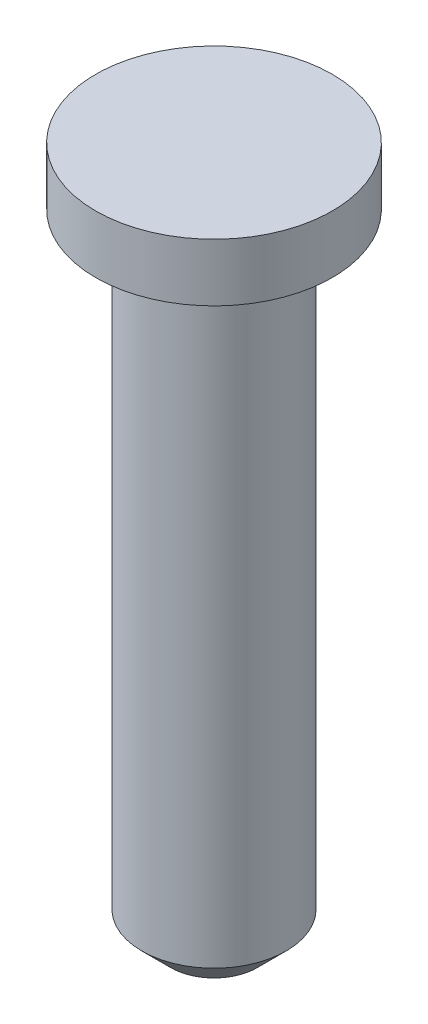
ISO-10303-21;
HEADER;
FILE_DESCRIPTION(('STEP AP214'),'2;1');
FILE_NAME('part.step','',(''),(''),'','','');
FILE_SCHEMA(('AUTOMOTIVE_DESIGN { 1 0 10303 214 1 1 1 1 }'));
ENDSEC;
DATA;
#1=APPLICATION_CONTEXT('core data for automotive mechanical design processes');
#2=APPLICATION_PROTOCOL_DEFINITION('international standard','automotive_design',2000,#1);
#3=PRODUCT_CONTEXT('',#1,'mechanical');
#4=PRODUCT('Part','Part','',(#3));
#5=PRODUCT_RELATED_PRODUCT_CATEGORY('part','',(#4));
#6=PRODUCT_DEFINITION_FORMATION('','',#4);
#7=PRODUCT_DEFINITION_CONTEXT('part definition',#1,'design');
#8=PRODUCT_DEFINITION('design','',#6,#7);
#9=PRODUCT_DEFINITION_SHAPE('','',#8);
#10=(LENGTH_UNIT() NAMED_UNIT(*) SI_UNIT(.MILLI.,.METRE.));
#11=(NAMED_UNIT(*) PLANE_ANGLE_UNIT() SI_UNIT($,.RADIAN.));
#12=(NAMED_UNIT(*) SI_UNIT($,.STERADIAN.) SOLID_ANGLE_UNIT());
#13=UNCERTAINTY_MEASURE_WITH_UNIT(LENGTH_MEASURE(1.E-05),#10,'distance_accuracy_value','');
#14=(GEOMETRIC_REPRESENTATION_CONTEXT(3) GLOBAL_UNCERTAINTY_ASSIGNED_CONTEXT((#13)) GLOBAL_UNIT_ASSIGNED_CONTEXT((#10,
#11,#12)) REPRESENTATION_CONTEXT('',''));
#15=CARTESIAN_POINT('',(0.,0.,0.));
#16=DIRECTION('',(0.,0.,1.));
#17=DIRECTION('',(1.,0.,0.));
#18=AXIS2_PLACEMENT_3D('',#15,#16,#17);
#19=CARTESIAN_POINT('',(0.,0.,0.));
#20=DIRECTION('',(0.,-1.,0.));
#21=DIRECTION('',(0.,0.,-1.));
#22=AXIS2_PLACEMENT_3D('',#19,#20,#21);
#23=PLANE('',#22);
#24=CARTESIAN_POINT('',(0.,0.,0.));
#25=DIRECTION('',(0.,1.,0.));
#26=DIRECTION('',(0.,0.,1.));
#27=AXIS2_PLACEMENT_3D('',#24,#25,#26);
#28=CIRCLE('',#27,2.05);
#29=CARTESIAN_POINT('',(0.,0.,2.05));
#30=VERTEX_POINT('',#29);
#31=EDGE_CURVE('E42',#30,#30,#28,.T.);
#32=ORIENTED_EDGE('',*,*,#31,.T.);
#33=EDGE_LOOP('',(#32));
#34=FACE_BOUND('',#33,.T.);
#35=ADVANCED_FACE('F31',(#34),#23,.F.);
#36=CARTESIAN_POINT('',(0.,0.,0.));
#37=DIRECTION('',(0.,1.,0.));
#38=DIRECTION('',(0.,0.,1.));
#39=AXIS2_PLACEMENT_3D('',#36,#37,#38);
#40=CYLINDRICAL_SURFACE('',#39,2.05);
#41=ORIENTED_EDGE('',*,*,#31,.F.);
#42=EDGE_LOOP('',(#41));
#43=FACE_BOUND('',#42,.T.);
#44=CARTESIAN_POINT('',(0.,-1.,0.));
#45=DIRECTION('',(0.,1.,0.));
#46=DIRECTION('',(0.,0.,1.));
#47=AXIS2_PLACEMENT_3D('',#44,#45,#46);
#48=CIRCLE('',#47,2.05);
#49=CARTESIAN_POINT('',(0.,-1.,2.05));
#50=VERTEX_POINT('',#49);
#51=EDGE_CURVE('E46',#50,#50,#48,.T.);
#52=ORIENTED_EDGE('',*,*,#51,.T.);
#53=EDGE_LOOP('',(#52));
#54=FACE_BOUND('',#53,.T.);
#55=ADVANCED_FACE('F66',(#43,#54),#40,.T.);
#56=CARTESIAN_POINT('',(2.05,-1.,0.));
#57=DIRECTION('',(0.,1.,0.));
#58=DIRECTION('',(0.,0.,1.));
#59=AXIS2_PLACEMENT_3D('',#56,#57,#58);
#60=PLANE('',#59);
#61=ORIENTED_EDGE('',*,*,#51,.F.);
#62=EDGE_LOOP('',(#61));
#63=FACE_BOUND('',#62,.T.);
#64=CARTESIAN_POINT('',(0.,-1.,0.));
#65=DIRECTION('',(0.,1.,0.));
#66=DIRECTION('',(0.,0.,1.));
#67=AXIS2_PLACEMENT_3D('',#64,#65,#66);
#68=CIRCLE('',#67,1.25);
#69=CARTESIAN_POINT('',(0.,-1.,1.25));
#70=VERTEX_POINT('',#69);
#71=EDGE_CURVE('E51',#70,#70,#68,.T.);
#72=ORIENTED_EDGE('',*,*,#71,.T.);
#73=EDGE_LOOP('',(#72));
#74=FACE_BOUND('',#73,.T.);
#75=ADVANCED_FACE('F55',(#63,#74),#60,.F.);
#76=CARTESIAN_POINT('',(0.,0.,0.));
#77=DIRECTION('',(0.,1.,0.));
#78=DIRECTION('',(0.,0.,1.));
#79=AXIS2_PLACEMENT_3D('',#76,#77,#78);
#80=CYLINDRICAL_SURFACE('',#79,1.25);
#81=CARTESIAN_POINT('',(0.,-11.5,0.));
#82=DIRECTION('',(0.,1.,0.));
#83=DIRECTION('',(0.,0.,1.));
#84=AXIS2_PLACEMENT_3D('',#81,#82,#83);
#85=CIRCLE('',#84,1.25);
#86=CARTESIAN_POINT('',(0.,-11.5,1.25));
#87=VERTEX_POINT('',#86);
#88=EDGE_CURVE('E38',#87,#87,#85,.T.);
#89=ORIENTED_EDGE('',*,*,#88,.T.);
#90=EDGE_LOOP('',(#89));
#91=FACE_BOUND('',#90,.T.);
#92=ORIENTED_EDGE('',*,*,#71,.F.);
#93=EDGE_LOOP('',(#92));
#94=FACE_BOUND('',#93,.T.);
#95=ADVANCED_FACE('F57',(#91,#94),#80,.T.);
#96=CARTESIAN_POINT('',(1.25,-12.,0.));
#97=DIRECTION('',(0.,1.,0.));
#98=DIRECTION('',(0.,0.,1.));
#99=AXIS2_PLACEMENT_3D('',#96,#97,#98);
#100=PLANE('',#99);
#101=CARTESIAN_POINT('',(0.,-12.,0.));
#102=DIRECTION('',(0.,1.,0.));
#103=DIRECTION('',(0.,0.,1.));
#104=AXIS2_PLACEMENT_3D('',#101,#102,#103);
#105=CIRCLE('',#104,0.750000000000004);
#106=CARTESIAN_POINT('',(0.,-12.,0.750000000000004));
#107=VERTEX_POINT('',#106);
#108=EDGE_CURVE('E10',#107,#107,#105,.F.);
#109=ORIENTED_EDGE('',*,*,#108,.T.);
#110=EDGE_LOOP('',(#109));
#111=FACE_BOUND('',#110,.T.);
#112=ADVANCED_FACE('F59',(#111),#100,.F.);
#113=CARTESIAN_POINT('',(0.,-11.5,0.));
#114=DIRECTION('',(0.,1.,0.));
#115=DIRECTION('',(0.,0.,1.));
#116=AXIS2_PLACEMENT_3D('',#113,#114,#115);
#117=CONICAL_SURFACE('',#116,1.25,0.78539816339745);
#118=ORIENTED_EDGE('',*,*,#108,.F.);
#119=EDGE_LOOP('',(#118));
#120=FACE_BOUND('',#119,.T.);
#121=ORIENTED_EDGE('',*,*,#88,.F.);
#122=EDGE_LOOP('',(#121));
#123=FACE_BOUND('',#122,.T.);
#124=ADVANCED_FACE('F33',(#120,#123),#117,.T.);
#125=CLOSED_SHELL('',(#35,#55,#75,#95,#112,#124));
#126=MANIFOLD_SOLID_BREP('B2',#125);
#127=ADVANCED_BREP_SHAPE_REPRESENTATION('',(#18,#126),#14);
#128=SHAPE_DEFINITION_REPRESENTATION(#9,#127);
ENDSEC;
END-ISO-10303-21;
